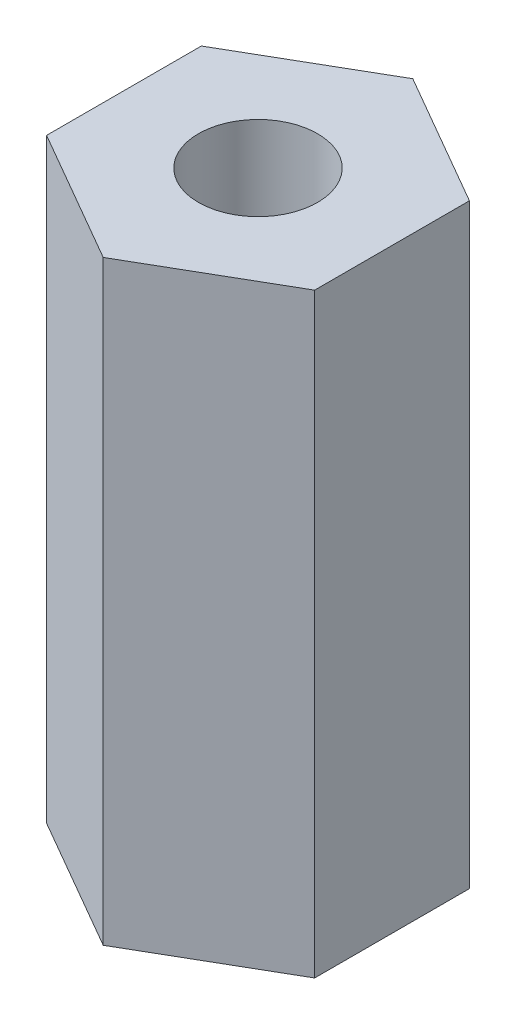
ISO-10303-21;
HEADER;
FILE_DESCRIPTION(('STEP AP214'),'2;1');
FILE_NAME('part.step','',(''),(''),'','','');
FILE_SCHEMA(('AUTOMOTIVE_DESIGN { 1 0 10303 214 1 1 1 1 }'));
ENDSEC;
DATA;
#1=APPLICATION_CONTEXT('core data for automotive mechanical design processes');
#2=APPLICATION_PROTOCOL_DEFINITION('international standard','automotive_design',2000,#1);
#3=PRODUCT_CONTEXT('',#1,'mechanical');
#4=PRODUCT('Part','Part','',(#3));
#5=PRODUCT_RELATED_PRODUCT_CATEGORY('part','',(#4));
#6=PRODUCT_DEFINITION_FORMATION('','',#4);
#7=PRODUCT_DEFINITION_CONTEXT('part definition',#1,'design');
#8=PRODUCT_DEFINITION('design','',#6,#7);
#9=PRODUCT_DEFINITION_SHAPE('','',#8);
#10=(LENGTH_UNIT() NAMED_UNIT(*) SI_UNIT(.MILLI.,.METRE.));
#11=(NAMED_UNIT(*) PLANE_ANGLE_UNIT() SI_UNIT($,.RADIAN.));
#12=(NAMED_UNIT(*) SI_UNIT($,.STERADIAN.) SOLID_ANGLE_UNIT());
#13=UNCERTAINTY_MEASURE_WITH_UNIT(LENGTH_MEASURE(1.E-05),#10,'distance_accuracy_value','');
#14=(GEOMETRIC_REPRESENTATION_CONTEXT(3) GLOBAL_UNCERTAINTY_ASSIGNED_CONTEXT((#13)) GLOBAL_UNIT_ASSIGNED_CONTEXT((#10,
#11,#12)) REPRESENTATION_CONTEXT('',''));
#15=CARTESIAN_POINT('',(0.,0.,0.));
#16=DIRECTION('',(0.,0.,1.));
#17=DIRECTION('',(1.,0.,0.));
#18=AXIS2_PLACEMENT_3D('',#15,#16,#17);
#19=CARTESIAN_POINT('',(0.,10.,0.));
#20=DIRECTION('',(0.,1.,0.));
#21=DIRECTION('',(0.,0.,1.));
#22=AXIS2_PLACEMENT_3D('',#19,#20,#21);
#23=PLANE('',#22);
#24=DIRECTION('',(-0.866025403784441,0.,-0.499999999999995));
#25=VECTOR('',#24,1.);
#26=CARTESIAN_POINT('',(2.24999999999999,10.,-1.29903810567669));
#27=LINE('',#26,#25);
#28=CARTESIAN_POINT('',(2.24999999999999,10.,-1.29903810567669));
#29=VERTEX_POINT('',#28);
#30=CARTESIAN_POINT('',(0.,10.,-2.59807621135332));
#31=VERTEX_POINT('',#30);
#32=EDGE_CURVE('E146',#29,#31,#27,.T.);
#33=ORIENTED_EDGE('',*,*,#32,.T.);
#34=DIRECTION('',(-0.866025403784438,0.,0.500000000000001));
#35=VECTOR('',#34,1.);
#36=CARTESIAN_POINT('',(0.,10.,-2.59807621135332));
#37=LINE('',#36,#35);
#38=CARTESIAN_POINT('',(-2.25,10.,-1.29903810567665));
#39=VERTEX_POINT('',#38);
#40=EDGE_CURVE('E94',#31,#39,#37,.T.);
#41=ORIENTED_EDGE('',*,*,#40,.T.);
#42=DIRECTION('',(0.,0.,1.));
#43=VECTOR('',#42,1.);
#44=CARTESIAN_POINT('',(-2.25,10.,-1.29903810567665));
#45=LINE('',#44,#43);
#46=CARTESIAN_POINT('',(-2.25,10.,1.29903810567667));
#47=VERTEX_POINT('',#46);
#48=EDGE_CURVE('E107',#39,#47,#45,.T.);
#49=ORIENTED_EDGE('',*,*,#48,.T.);
#50=DIRECTION('',(0.866025403784442,0.,0.499999999999995));
#51=VECTOR('',#50,1.);
#52=CARTESIAN_POINT('',(-2.25,10.,1.29903810567667));
#53=LINE('',#52,#51);
#54=CARTESIAN_POINT('',(0.,10.,2.59807621135332));
#55=VERTEX_POINT('',#54);
#56=EDGE_CURVE('E101',#47,#55,#53,.T.);
#57=ORIENTED_EDGE('',*,*,#56,.T.);
#58=DIRECTION('',(0.866025403784435,0.,-0.500000000000007));
#59=VECTOR('',#58,1.);
#60=CARTESIAN_POINT('',(0.,10.,2.59807621135332));
#61=LINE('',#60,#59);
#62=CARTESIAN_POINT('',(2.25000000000001,10.,1.29903810567664));
#63=VERTEX_POINT('',#62);
#64=EDGE_CURVE('E105',#55,#63,#61,.T.);
#65=ORIENTED_EDGE('',*,*,#64,.T.);
#66=DIRECTION('',(0.,0.,-1.));
#67=VECTOR('',#66,1.);
#68=CARTESIAN_POINT('',(2.25000000000001,10.,1.29903810567664));
#69=LINE('',#68,#67);
#70=EDGE_CURVE('E57',#63,#29,#69,.T.);
#71=ORIENTED_EDGE('',*,*,#70,.T.);
#72=EDGE_LOOP('',(#33,#41,#49,#57,#65,#71));
#73=FACE_BOUND('',#72,.T.);
#74=CARTESIAN_POINT('',(0.,10.,0.));
#75=DIRECTION('',(0.,1.,0.));
#76=DIRECTION('',(0.,0.,1.));
#77=AXIS2_PLACEMENT_3D('',#74,#75,#76);
#78=CIRCLE('',#77,1.);
#79=CARTESIAN_POINT('',(0.,10.,1.));
#80=VERTEX_POINT('',#79);
#81=EDGE_CURVE('E134',#80,#80,#78,.T.);
#82=ORIENTED_EDGE('',*,*,#81,.F.);
#83=EDGE_LOOP('',(#82));
#84=FACE_BOUND('',#83,.T.);
#85=ADVANCED_FACE('F39',(#73,#84),#23,.T.);
#86=CARTESIAN_POINT('',(0.,0.,0.));
#87=DIRECTION('',(0.,1.,0.));
#88=DIRECTION('',(0.,0.,1.));
#89=AXIS2_PLACEMENT_3D('',#86,#87,#88);
#90=PLANE('',#89);
#91=DIRECTION('',(-0.866025403784441,0.,-0.499999999999995));
#92=VECTOR('',#91,1.);
#93=CARTESIAN_POINT('',(2.24999999999999,0.,-1.29903810567669));
#94=LINE('',#93,#92);
#95=CARTESIAN_POINT('',(2.24999999999999,0.,-1.29903810567669));
#96=VERTEX_POINT('',#95);
#97=CARTESIAN_POINT('',(0.,0.,-2.59807621135332));
#98=VERTEX_POINT('',#97);
#99=EDGE_CURVE('E129',#96,#98,#94,.T.);
#100=ORIENTED_EDGE('',*,*,#99,.F.);
#101=DIRECTION('',(0.,0.,-1.));
#102=VECTOR('',#101,1.);
#103=CARTESIAN_POINT('',(2.25000000000001,0.,1.29903810567664));
#104=LINE('',#103,#102);
#105=CARTESIAN_POINT('',(2.25000000000001,0.,1.29903810567664));
#106=VERTEX_POINT('',#105);
#107=EDGE_CURVE('E86',#106,#96,#104,.T.);
#108=ORIENTED_EDGE('',*,*,#107,.F.);
#109=DIRECTION('',(0.866025403784435,0.,-0.500000000000007));
#110=VECTOR('',#109,1.);
#111=CARTESIAN_POINT('',(0.,0.,2.59807621135332));
#112=LINE('',#111,#110);
#113=CARTESIAN_POINT('',(0.,0.,2.59807621135332));
#114=VERTEX_POINT('',#113);
#115=EDGE_CURVE('E80',#114,#106,#112,.T.);
#116=ORIENTED_EDGE('',*,*,#115,.F.);
#117=DIRECTION('',(0.866025403784442,0.,0.499999999999995));
#118=VECTOR('',#117,1.);
#119=CARTESIAN_POINT('',(-2.25,0.,1.29903810567667));
#120=LINE('',#119,#118);
#121=CARTESIAN_POINT('',(-2.25,0.,1.29903810567667));
#122=VERTEX_POINT('',#121);
#123=EDGE_CURVE('E116',#122,#114,#120,.T.);
#124=ORIENTED_EDGE('',*,*,#123,.F.);
#125=DIRECTION('',(0.,0.,1.));
#126=VECTOR('',#125,1.);
#127=CARTESIAN_POINT('',(-2.25,0.,-1.29903810567665));
#128=LINE('',#127,#126);
#129=CARTESIAN_POINT('',(-2.25,0.,-1.29903810567665));
#130=VERTEX_POINT('',#129);
#131=EDGE_CURVE('E137',#130,#122,#128,.T.);
#132=ORIENTED_EDGE('',*,*,#131,.F.);
#133=DIRECTION('',(-0.866025403784438,0.,0.500000000000001));
#134=VECTOR('',#133,1.);
#135=CARTESIAN_POINT('',(0.,0.,-2.59807621135332));
#136=LINE('',#135,#134);
#137=EDGE_CURVE('E133',#98,#130,#136,.T.);
#138=ORIENTED_EDGE('',*,*,#137,.F.);
#139=EDGE_LOOP('',(#100,#108,#116,#124,#132,#138));
#140=FACE_BOUND('',#139,.T.);
#141=CARTESIAN_POINT('',(0.,0.,0.));
#142=DIRECTION('',(0.,1.,0.));
#143=DIRECTION('',(0.,0.,1.));
#144=AXIS2_PLACEMENT_3D('',#141,#142,#143);
#145=CIRCLE('',#144,1.);
#146=CARTESIAN_POINT('',(0.,0.,1.));
#147=VERTEX_POINT('',#146);
#148=EDGE_CURVE('E243',#147,#147,#145,.T.);
#149=ORIENTED_EDGE('',*,*,#148,.T.);
#150=EDGE_LOOP('',(#149));
#151=FACE_BOUND('',#150,.T.);
#152=ADVANCED_FACE('F159',(#140,#151),#90,.F.);
#153=CARTESIAN_POINT('',(2.24999999999999,10.,-1.29903810567669));
#154=DIRECTION('',(-0.499999999999995,0.,0.866025403784442));
#155=DIRECTION('',(0.866025403784442,0.,0.499999999999995));
#156=AXIS2_PLACEMENT_3D('',#153,#154,#155);
#157=PLANE('',#156);
#158=ORIENTED_EDGE('',*,*,#99,.T.);
#159=DIRECTION('',(0.,-1.,0.));
#160=VECTOR('',#159,1.);
#161=CARTESIAN_POINT('',(0.,10.,-2.59807621135332));
#162=LINE('',#161,#160);
#163=EDGE_CURVE('E11',#31,#98,#162,.T.);
#164=ORIENTED_EDGE('',*,*,#163,.F.);
#165=ORIENTED_EDGE('',*,*,#32,.F.);
#166=DIRECTION('',(0.,-1.,0.));
#167=VECTOR('',#166,1.);
#168=CARTESIAN_POINT('',(2.24999999999999,10.,-1.29903810567669));
#169=LINE('',#168,#167);
#170=EDGE_CURVE('E125',#29,#96,#169,.T.);
#171=ORIENTED_EDGE('',*,*,#170,.T.);
#172=EDGE_LOOP('',(#158,#164,#165,#171));
#173=FACE_BOUND('',#172,.T.);
#174=ADVANCED_FACE('F41',(#173),#157,.F.);
#175=CARTESIAN_POINT('',(0.,10.,-2.59807621135332));
#176=DIRECTION('',(0.500000000000001,0.,0.866025403784438));
#177=DIRECTION('',(0.866025403784438,0.,-0.500000000000001));
#178=AXIS2_PLACEMENT_3D('',#175,#176,#177);
#179=PLANE('',#178);
#180=ORIENTED_EDGE('',*,*,#137,.T.);
#181=DIRECTION('',(0.,-1.,0.));
#182=VECTOR('',#181,1.);
#183=CARTESIAN_POINT('',(-2.25,10.,-1.29903810567665));
#184=LINE('',#183,#182);
#185=EDGE_CURVE('E49',#39,#130,#184,.T.);
#186=ORIENTED_EDGE('',*,*,#185,.F.);
#187=ORIENTED_EDGE('',*,*,#40,.F.);
#188=ORIENTED_EDGE('',*,*,#163,.T.);
#189=EDGE_LOOP('',(#180,#186,#187,#188));
#190=FACE_BOUND('',#189,.T.);
#191=ADVANCED_FACE('F184',(#190),#179,.F.);
#192=CARTESIAN_POINT('',(-2.25,10.,-1.29903810567665));
#193=DIRECTION('',(1.,0.,0.));
#194=DIRECTION('',(0.,0.,-1.));
#195=AXIS2_PLACEMENT_3D('',#192,#193,#194);
#196=PLANE('',#195);
#197=ORIENTED_EDGE('',*,*,#131,.T.);
#198=DIRECTION('',(0.,-1.,0.));
#199=VECTOR('',#198,1.);
#200=CARTESIAN_POINT('',(-2.25,10.,1.29903810567667));
#201=LINE('',#200,#199);
#202=EDGE_CURVE('E118',#47,#122,#201,.T.);
#203=ORIENTED_EDGE('',*,*,#202,.F.);
#204=ORIENTED_EDGE('',*,*,#48,.F.);
#205=ORIENTED_EDGE('',*,*,#185,.T.);
#206=EDGE_LOOP('',(#197,#203,#204,#205));
#207=FACE_BOUND('',#206,.T.);
#208=ADVANCED_FACE('F156',(#207),#196,.F.);
#209=CARTESIAN_POINT('',(-2.25,10.,1.29903810567667));
#210=DIRECTION('',(0.499999999999995,0.,-0.866025403784442));
#211=DIRECTION('',(-0.866025403784442,0.,-0.499999999999995));
#212=AXIS2_PLACEMENT_3D('',#209,#210,#211);
#213=PLANE('',#212);
#214=ORIENTED_EDGE('',*,*,#123,.T.);
#215=DIRECTION('',(0.,-1.,0.));
#216=VECTOR('',#215,1.);
#217=CARTESIAN_POINT('',(0.,10.,2.59807621135332));
#218=LINE('',#217,#216);
#219=EDGE_CURVE('E113',#55,#114,#218,.T.);
#220=ORIENTED_EDGE('',*,*,#219,.F.);
#221=ORIENTED_EDGE('',*,*,#56,.F.);
#222=ORIENTED_EDGE('',*,*,#202,.T.);
#223=EDGE_LOOP('',(#214,#220,#221,#222));
#224=FACE_BOUND('',#223,.T.);
#225=ADVANCED_FACE('F114',(#224),#213,.F.);
#226=CARTESIAN_POINT('',(0.,10.,2.59807621135332));
#227=DIRECTION('',(-0.500000000000007,0.,-0.866025403784435));
#228=DIRECTION('',(-0.866025403784435,0.,0.500000000000007));
#229=AXIS2_PLACEMENT_3D('',#226,#227,#228);
#230=PLANE('',#229);
#231=ORIENTED_EDGE('',*,*,#115,.T.);
#232=DIRECTION('',(0.,-1.,0.));
#233=VECTOR('',#232,1.);
#234=CARTESIAN_POINT('',(2.25000000000001,10.,1.29903810567664));
#235=LINE('',#234,#233);
#236=EDGE_CURVE('E119',#63,#106,#235,.T.);
#237=ORIENTED_EDGE('',*,*,#236,.F.);
#238=ORIENTED_EDGE('',*,*,#64,.F.);
#239=ORIENTED_EDGE('',*,*,#219,.T.);
#240=EDGE_LOOP('',(#231,#237,#238,#239));
#241=FACE_BOUND('',#240,.T.);
#242=ADVANCED_FACE('F121',(#241),#230,.F.);
#243=CARTESIAN_POINT('',(2.25000000000001,10.,1.29903810567664));
#244=DIRECTION('',(-1.,0.,0.));
#245=DIRECTION('',(0.,0.,1.));
#246=AXIS2_PLACEMENT_3D('',#243,#244,#245);
#247=PLANE('',#246);
#248=ORIENTED_EDGE('',*,*,#107,.T.);
#249=ORIENTED_EDGE('',*,*,#170,.F.);
#250=ORIENTED_EDGE('',*,*,#70,.F.);
#251=ORIENTED_EDGE('',*,*,#236,.T.);
#252=EDGE_LOOP('',(#248,#249,#250,#251));
#253=FACE_BOUND('',#252,.T.);
#254=ADVANCED_FACE('F164',(#253),#247,.F.);
#255=CARTESIAN_POINT('',(0.,10.,0.));
#256=DIRECTION('',(0.,-1.,0.));
#257=DIRECTION('',(0.,0.,-1.));
#258=AXIS2_PLACEMENT_3D('',#255,#256,#257);
#259=CYLINDRICAL_SURFACE('',#258,1.);
#260=ORIENTED_EDGE('',*,*,#81,.T.);
#261=EDGE_LOOP('',(#260));
#262=FACE_BOUND('',#261,.T.);
#263=ORIENTED_EDGE('',*,*,#148,.F.);
#264=EDGE_LOOP('',(#263));
#265=FACE_BOUND('',#264,.T.);
#266=ADVANCED_FACE('F166',(#262,#265),#259,.F.);
#267=CLOSED_SHELL('',(#85,#152,#174,#191,#208,#225,#242,#254,#266));
#268=MANIFOLD_SOLID_BREP('B2',#267);
#269=ADVANCED_BREP_SHAPE_REPRESENTATION('',(#18,#268),#14);
#270=SHAPE_DEFINITION_REPRESENTATION(#9,#269);
ENDSEC;
END-ISO-10303-21;
